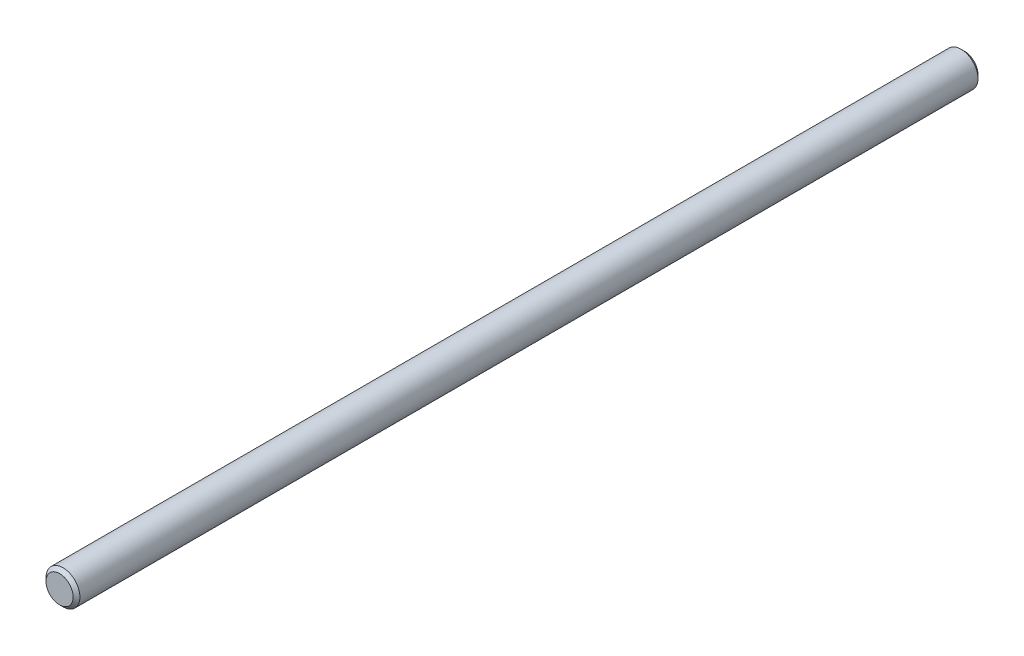
ISO-10303-21;
HEADER;
FILE_DESCRIPTION(('STEP AP214'),'2;1');
FILE_NAME('part.step','',(''),(''),'','','');
FILE_SCHEMA(('AUTOMOTIVE_DESIGN { 1 0 10303 214 1 1 1 1 }'));
ENDSEC;
DATA;
#1=APPLICATION_CONTEXT('core data for automotive mechanical design processes');
#2=APPLICATION_PROTOCOL_DEFINITION('international standard','automotive_design',2000,#1);
#3=PRODUCT_CONTEXT('',#1,'mechanical');
#4=PRODUCT('Part','Part','',(#3));
#5=PRODUCT_RELATED_PRODUCT_CATEGORY('part','',(#4));
#6=PRODUCT_DEFINITION_FORMATION('','',#4);
#7=PRODUCT_DEFINITION_CONTEXT('part definition',#1,'design');
#8=PRODUCT_DEFINITION('design','',#6,#7);
#9=PRODUCT_DEFINITION_SHAPE('','',#8);
#10=(LENGTH_UNIT() NAMED_UNIT(*) SI_UNIT(.MILLI.,.METRE.));
#11=(NAMED_UNIT(*) PLANE_ANGLE_UNIT() SI_UNIT($,.RADIAN.));
#12=(NAMED_UNIT(*) SI_UNIT($,.STERADIAN.) SOLID_ANGLE_UNIT());
#13=UNCERTAINTY_MEASURE_WITH_UNIT(LENGTH_MEASURE(1.E-05),#10,'distance_accuracy_value','');
#14=(GEOMETRIC_REPRESENTATION_CONTEXT(3) GLOBAL_UNCERTAINTY_ASSIGNED_CONTEXT((#13)) GLOBAL_UNIT_ASSIGNED_CONTEXT((#10,
#11,#12)) REPRESENTATION_CONTEXT('',''));
#15=CARTESIAN_POINT('',(0.,0.,0.));
#16=DIRECTION('',(0.,0.,1.));
#17=DIRECTION('',(1.,0.,0.));
#18=AXIS2_PLACEMENT_3D('',#15,#16,#17);
#19=CARTESIAN_POINT('',(0.,0.,127.));
#20=DIRECTION('',(0.,0.,-1.));
#21=DIRECTION('',(-1.,0.,0.));
#22=AXIS2_PLACEMENT_3D('',#19,#20,#21);
#23=CYLINDRICAL_SURFACE('',#22,4.7625);
#24=CARTESIAN_POINT('',(0.,0.,-126.0475));
#25=DIRECTION('',(0.,0.,1.));
#26=DIRECTION('',(1.,0.,0.));
#27=AXIS2_PLACEMENT_3D('',#24,#25,#26);
#28=CIRCLE('',#27,4.7625);
#29=CARTESIAN_POINT('',(-4.7625,0.,-126.0475));
#30=VERTEX_POINT('',#29);
#31=EDGE_CURVE('E48',#30,#30,#28,.T.);
#32=CARTESIAN_POINT('',(0.,0.,126.0475));
#33=DIRECTION('',(0.,0.,1.));
#34=DIRECTION('',(1.,0.,0.));
#35=AXIS2_PLACEMENT_3D('',#32,#33,#34);
#36=CIRCLE('',#35,4.7625);
#37=CARTESIAN_POINT('',(-4.7625,0.,126.0475));
#38=VERTEX_POINT('',#37);
#39=EDGE_CURVE('E52',#38,#38,#36,.F.);
#40=CARTESIAN_POINT('',(-4.7625,0.,-126.0475));
#41=CARTESIAN_POINT('',(-4.7625,0.,-123.421510416667));
#42=CARTESIAN_POINT('',(-4.7625,0.,-120.795520833333));
#43=CARTESIAN_POINT('',(-4.7625,0.,-115.543541666667));
#44=CARTESIAN_POINT('',(-4.7625,0.,-112.917552083333));
#45=CARTESIAN_POINT('',(-4.7625,0.,-107.665572916667));
#46=CARTESIAN_POINT('',(-4.7625,0.,-105.039583333333));
#47=CARTESIAN_POINT('',(-4.7625,0.,-99.7876041666666));
#48=CARTESIAN_POINT('',(-4.7625,0.,-97.1616145833333));
#49=CARTESIAN_POINT('',(-4.7625,0.,-91.9096354166666));
#50=CARTESIAN_POINT('',(-4.7625,0.,-89.2836458333333));
#51=CARTESIAN_POINT('',(-4.7625,0.,-84.0316666666667));
#52=CARTESIAN_POINT('',(-4.7625,0.,-81.4056770833333));
#53=CARTESIAN_POINT('',(-4.7625,0.,-76.1536979166666));
#54=CARTESIAN_POINT('',(-4.7625,0.,-73.5277083333333));
#55=CARTESIAN_POINT('',(-4.7625,0.,-68.2757291666667));
#56=CARTESIAN_POINT('',(-4.7625,0.,-65.6497395833333));
#57=CARTESIAN_POINT('',(-4.7625,0.,-60.3977604166667));
#58=CARTESIAN_POINT('',(-4.7625,0.,-57.7717708333333));
#59=CARTESIAN_POINT('',(-4.7625,0.,-52.5197916666667));
#60=CARTESIAN_POINT('',(-4.7625,0.,-49.8938020833333));
#61=CARTESIAN_POINT('',(-4.7625,0.,-44.6418229166667));
#62=CARTESIAN_POINT('',(-4.7625,0.,-42.0158333333333));
#63=CARTESIAN_POINT('',(-4.7625,0.,-36.7638541666667));
#64=CARTESIAN_POINT('',(-4.7625,0.,-34.1378645833333));
#65=CARTESIAN_POINT('',(-4.7625,0.,-28.8858854166667));
#66=CARTESIAN_POINT('',(-4.7625,0.,-26.2598958333333));
#67=CARTESIAN_POINT('',(-4.7625,0.,-21.0079166666667));
#68=CARTESIAN_POINT('',(-4.7625,0.,-18.3819270833333));
#69=CARTESIAN_POINT('',(-4.7625,0.,-13.1299479166667));
#70=CARTESIAN_POINT('',(-4.7625,0.,-10.5039583333333));
#71=CARTESIAN_POINT('',(-4.7625,0.,-5.25197916666666));
#72=CARTESIAN_POINT('',(-4.7625,0.,-2.62598958333333));
#73=CARTESIAN_POINT('',(-4.7625,0.,2.62598958333333));
#74=CARTESIAN_POINT('',(-4.7625,0.,5.25197916666666));
#75=CARTESIAN_POINT('',(-4.7625,0.,10.5039583333333));
#76=CARTESIAN_POINT('',(-4.7625,0.,13.1299479166667));
#77=CARTESIAN_POINT('',(-4.7625,0.,18.3819270833333));
#78=CARTESIAN_POINT('',(-4.7625,0.,21.0079166666667));
#79=CARTESIAN_POINT('',(-4.7625,0.,26.2598958333333));
#80=CARTESIAN_POINT('',(-4.7625,0.,28.8858854166667));
#81=CARTESIAN_POINT('',(-4.7625,0.,34.1378645833333));
#82=CARTESIAN_POINT('',(-4.7625,0.,36.7638541666667));
#83=CARTESIAN_POINT('',(-4.7625,0.,42.0158333333333));
#84=CARTESIAN_POINT('',(-4.7625,0.,44.6418229166667));
#85=CARTESIAN_POINT('',(-4.7625,0.,49.8938020833333));
#86=CARTESIAN_POINT('',(-4.7625,0.,52.5197916666667));
#87=CARTESIAN_POINT('',(-4.7625,0.,57.7717708333333));
#88=CARTESIAN_POINT('',(-4.7625,0.,60.3977604166667));
#89=CARTESIAN_POINT('',(-4.7625,0.,65.6497395833333));
#90=CARTESIAN_POINT('',(-4.7625,0.,68.2757291666667));
#91=CARTESIAN_POINT('',(-4.7625,0.,73.5277083333333));
#92=CARTESIAN_POINT('',(-4.7625,0.,76.1536979166666));
#93=CARTESIAN_POINT('',(-4.7625,0.,81.4056770833333));
#94=CARTESIAN_POINT('',(-4.7625,0.,84.0316666666667));
#95=CARTESIAN_POINT('',(-4.7625,0.,89.2836458333333));
#96=CARTESIAN_POINT('',(-4.7625,0.,91.9096354166666));
#97=CARTESIAN_POINT('',(-4.7625,0.,97.1616145833333));
#98=CARTESIAN_POINT('',(-4.7625,0.,99.7876041666666));
#99=CARTESIAN_POINT('',(-4.7625,0.,105.039583333333));
#100=CARTESIAN_POINT('',(-4.7625,0.,107.665572916667));
#101=CARTESIAN_POINT('',(-4.7625,0.,112.917552083333));
#102=CARTESIAN_POINT('',(-4.7625,0.,115.543541666667));
#103=CARTESIAN_POINT('',(-4.7625,0.,120.795520833333));
#104=CARTESIAN_POINT('',(-4.7625,0.,123.421510416667));
#105=CARTESIAN_POINT('',(-4.7625,0.,126.0475));
#106=B_SPLINE_CURVE_WITH_KNOTS('',3,(#40,#41,#42,#43,#44,#45,#46,#47,#48,#49,#50,#51,#52,#53,
#54,#55,#56,#57,#58,#59,#60,#61,#62,#63,#64,#65,#66,#67,#68,#69,#70,#71,#72,#73,#74,#75,#76,#77,
#78,#79,#80,#81,#82,#83,#84,#85,#86,#87,#88,#89,#90,#91,#92,#93,#94,#95,#96,#97,#98,#99,#100,
#101,#102,#103,#104,#105),.UNSPECIFIED.,.F.,.F.,(4,2,2,2,2,2,2,2,2,2,2,2,2,2,2,2,2,2,2,2,2,2,2,
2,2,2,2,2,2,2,2,2,4),(0.,7.87796874999999,15.7559375,23.63390625,31.511875,39.38984375,
47.2678125,55.14578125,63.02375,70.90171875,78.7796875,86.65765625,94.535625,102.41359375,
110.2915625,118.16953125,126.0475,133.92546875,141.8034375,149.68140625,157.559375,165.43734375,
173.3153125,181.19328125,189.07125,196.94921875,204.8271875,212.70515625,220.583125,
228.46109375,236.3390625,244.21703125,252.095),.UNSPECIFIED.);
#107=EDGE_CURVE('BSEAM37',#30,#38,#106,.T.);
#108=ORIENTED_EDGE('',*,*,#31,.T.);
#109=ORIENTED_EDGE('',*,*,#39,.T.);
#110=ORIENTED_EDGE('',*,*,#107,.T.);
#111=ORIENTED_EDGE('',*,*,#107,.F.);
#112=EDGE_LOOP('',(#108,#110,#109,#111));
#113=FACE_BOUND('',#112,.T.);
#114=ADVANCED_FACE('F37',(#113),#23,.T.);
#115=CARTESIAN_POINT('',(0.,0.,127.));
#116=DIRECTION('',(0.,0.,1.));
#117=DIRECTION('',(1.,0.,0.));
#118=AXIS2_PLACEMENT_3D('',#115,#116,#117);
#119=PLANE('',#118);
#120=CARTESIAN_POINT('',(0.,0.,127.));
#121=DIRECTION('',(0.,0.,1.));
#122=DIRECTION('',(1.,0.,0.));
#123=AXIS2_PLACEMENT_3D('',#120,#121,#122);
#124=CIRCLE('',#123,3.80999999999998);
#125=CARTESIAN_POINT('',(-3.80999999999999,0.,127.));
#126=VERTEX_POINT('',#125);
#127=EDGE_CURVE('E10',#126,#126,#124,.T.);
#128=ORIENTED_EDGE('',*,*,#127,.T.);
#129=EDGE_LOOP('',(#128));
#130=FACE_BOUND('',#129,.T.);
#131=ADVANCED_FACE('F68',(#130),#119,.T.);
#132=CARTESIAN_POINT('',(0.,0.,-127.));
#133=DIRECTION('',(0.,0.,1.));
#134=DIRECTION('',(1.,0.,0.));
#135=AXIS2_PLACEMENT_3D('',#132,#133,#134);
#136=PLANE('',#135);
#137=CARTESIAN_POINT('',(0.,0.,-127.));
#138=DIRECTION('',(0.,0.,1.));
#139=DIRECTION('',(1.,0.,0.));
#140=AXIS2_PLACEMENT_3D('',#137,#138,#139);
#141=CIRCLE('',#140,3.80999999999995);
#142=CARTESIAN_POINT('',(3.80999999999995,0.,-127.));
#143=VERTEX_POINT('',#142);
#144=EDGE_CURVE('E44',#143,#143,#141,.F.);
#145=ORIENTED_EDGE('',*,*,#144,.T.);
#146=EDGE_LOOP('',(#145));
#147=FACE_BOUND('',#146,.T.);
#148=ADVANCED_FACE('F65',(#147),#136,.F.);
#149=CARTESIAN_POINT('',(0.,0.,-126.0475));
#150=DIRECTION('',(0.,0.,1.));
#151=DIRECTION('',(1.,0.,0.));
#152=AXIS2_PLACEMENT_3D('',#149,#150,#151);
#153=CONICAL_SURFACE('',#152,4.7625,0.785398163397461);
#154=ORIENTED_EDGE('',*,*,#144,.F.);
#155=EDGE_LOOP('',(#154));
#156=FACE_BOUND('',#155,.T.);
#157=ORIENTED_EDGE('',*,*,#31,.F.);
#158=EDGE_LOOP('',(#157));
#159=FACE_BOUND('',#158,.T.);
#160=ADVANCED_FACE('F61',(#156,#159),#153,.T.);
#161=CARTESIAN_POINT('',(0.,0.,127.));
#162=DIRECTION('',(0.,0.,-1.));
#163=DIRECTION('',(-1.,0.,0.));
#164=AXIS2_PLACEMENT_3D('',#161,#162,#163);
#165=CONICAL_SURFACE('',#164,3.80999999999998,0.785398163397447);
#166=CARTESIAN_POINT('',(-4.76250000000001,0.,126.0475));
#167=CARTESIAN_POINT('',(-4.75257812500001,0.,126.057421875));
#168=CARTESIAN_POINT('',(-4.74265625000001,0.,126.06734375));
#169=CARTESIAN_POINT('',(-4.72281250000001,0.,126.0871875));
#170=CARTESIAN_POINT('',(-4.71289062500002,0.,126.097109375));
#171=CARTESIAN_POINT('',(-4.69304687500001,0.,126.116953125));
#172=CARTESIAN_POINT('',(-4.68312500000001,0.,126.126875));
#173=CARTESIAN_POINT('',(-4.66328125000001,0.,126.14671875));
#174=CARTESIAN_POINT('',(-4.65335937500001,0.,126.156640625));
#175=CARTESIAN_POINT('',(-4.63351562500001,0.,126.176484375));
#176=CARTESIAN_POINT('',(-4.62359375000001,0.,126.18640625));
#177=CARTESIAN_POINT('',(-4.60375000000001,0.,126.20625));
#178=CARTESIAN_POINT('',(-4.59382812500001,0.,126.216171875));
#179=CARTESIAN_POINT('',(-4.57398437500001,0.,126.236015625));
#180=CARTESIAN_POINT('',(-4.56406250000001,0.,126.2459375));
#181=CARTESIAN_POINT('',(-4.54421875000001,0.,126.26578125));
#182=CARTESIAN_POINT('',(-4.53429687500001,0.,126.275703125));
#183=CARTESIAN_POINT('',(-4.514453125,0.,126.295546875));
#184=CARTESIAN_POINT('',(-4.50453125000001,0.,126.30546875));
#185=CARTESIAN_POINT('',(-4.48468750000001,0.,126.3253125));
#186=CARTESIAN_POINT('',(-4.47476562500001,0.,126.335234375));
#187=CARTESIAN_POINT('',(-4.45492187500001,0.,126.355078125));
#188=CARTESIAN_POINT('',(-4.44500000000001,0.,126.365));
#189=CARTESIAN_POINT('',(-4.42515625,0.,126.38484375));
#190=CARTESIAN_POINT('',(-4.415234375,0.,126.394765625));
#191=CARTESIAN_POINT('',(-4.39539062500001,0.,126.414609375));
#192=CARTESIAN_POINT('',(-4.38546875000001,0.,126.42453125));
#193=CARTESIAN_POINT('',(-4.36562500000001,0.,126.444375));
#194=CARTESIAN_POINT('',(-4.355703125,0.,126.454296875));
#195=CARTESIAN_POINT('',(-4.335859375,0.,126.474140625));
#196=CARTESIAN_POINT('',(-4.32593750000001,0.,126.4840625));
#197=CARTESIAN_POINT('',(-4.30609375000001,0.,126.50390625));
#198=CARTESIAN_POINT('',(-4.296171875,0.,126.513828125));
#199=CARTESIAN_POINT('',(-4.276328125,0.,126.533671875));
#200=CARTESIAN_POINT('',(-4.26640625,0.,126.54359375));
#201=CARTESIAN_POINT('',(-4.2465625,0.,126.5634375));
#202=CARTESIAN_POINT('',(-4.23664062500001,0.,126.573359375));
#203=CARTESIAN_POINT('',(-4.216796875,0.,126.593203125));
#204=CARTESIAN_POINT('',(-4.206875,0.,126.603125));
#205=CARTESIAN_POINT('',(-4.18703125,0.,126.62296875));
#206=CARTESIAN_POINT('',(-4.177109375,0.,126.632890625));
#207=CARTESIAN_POINT('',(-4.157265625,0.,126.652734375));
#208=CARTESIAN_POINT('',(-4.14734375,0.,126.66265625));
#209=CARTESIAN_POINT('',(-4.1275,0.,126.6825));
#210=CARTESIAN_POINT('',(-4.117578125,0.,126.692421875));
#211=CARTESIAN_POINT('',(-4.097734375,0.,126.712265625));
#212=CARTESIAN_POINT('',(-4.0878125,0.,126.7221875));
#213=CARTESIAN_POINT('',(-4.06796875,0.,126.74203125));
#214=CARTESIAN_POINT('',(-4.058046875,0.,126.751953125));
#215=CARTESIAN_POINT('',(-4.038203125,0.,126.771796875));
#216=CARTESIAN_POINT('',(-4.02828125,0.,126.78171875));
#217=CARTESIAN_POINT('',(-4.0084375,0.,126.8015625));
#218=CARTESIAN_POINT('',(-3.998515625,0.,126.811484375));
#219=CARTESIAN_POINT('',(-3.978671875,0.,126.831328125));
#220=CARTESIAN_POINT('',(-3.96875,0.,126.84125));
#221=CARTESIAN_POINT('',(-3.94890624999999,0.,126.86109375));
#222=CARTESIAN_POINT('',(-3.938984375,0.,126.871015625));
#223=CARTESIAN_POINT('',(-3.919140625,0.,126.890859375));
#224=CARTESIAN_POINT('',(-3.90921875,0.,126.90078125));
#225=CARTESIAN_POINT('',(-3.889375,0.,126.920625));
#226=CARTESIAN_POINT('',(-3.87945312499999,0.,126.930546875));
#227=CARTESIAN_POINT('',(-3.85960937499999,0.,126.950390625));
#228=CARTESIAN_POINT('',(-3.84968749999999,0.,126.9603125));
#229=CARTESIAN_POINT('',(-3.82984375,0.,126.98015625));
#230=CARTESIAN_POINT('',(-3.819921875,0.,126.990078125));
#231=CARTESIAN_POINT('',(-3.80999999999999,0.,127.));
#232=B_SPLINE_CURVE_WITH_KNOTS('',3,(#166,#167,#168,#169,#170,#171,#172,#173,#174,#175,#176,
#177,#178,#179,#180,#181,#182,#183,#184,#185,#186,#187,#188,#189,#190,#191,#192,#193,#194,#195,
#196,#197,#198,#199,#200,#201,#202,#203,#204,#205,#206,#207,#208,#209,#210,#211,#212,#213,#214,
#215,#216,#217,#218,#219,#220,#221,#222,#223,#224,#225,#226,#227,#228,#229,#230,#231),
.UNSPECIFIED.,.F.,.F.,(4,2,2,2,2,2,2,2,2,2,2,2,2,2,2,2,2,2,2,2,2,2,2,2,2,2,2,2,2,2,2,2,4),(0.,
0.04209495056752,0.08418990113504,0.12628485170254,0.16837980227006,0.21047475283758,
0.25256970340508,0.2946646539726,0.336759604540101,0.378854555107621,0.42094950567514,
0.46304445624264,0.50513940681016,0.54723435737768,0.589329307945181,0.631424258512701,
0.673519209080201,0.715614159647721,0.757709110215241,0.799804060782742,0.841899011350261,
0.883993961917781,0.926088912485281,0.968183863052801,1.01027881362032,1.05237376418782,
1.09446871475534,1.13656366532284,1.17865861589036,1.22075356645788,1.26284851702538,
1.3049434675929,1.34703841816042),.UNSPECIFIED.);
#233=EDGE_CURVE('BSEAM39',#38,#126,#232,.T.);
#234=ORIENTED_EDGE('',*,*,#39,.F.);
#235=ORIENTED_EDGE('',*,*,#127,.F.);
#236=ORIENTED_EDGE('',*,*,#233,.T.);
#237=ORIENTED_EDGE('',*,*,#233,.F.);
#238=EDGE_LOOP('',(#234,#236,#235,#237));
#239=FACE_BOUND('',#238,.T.);
#240=ADVANCED_FACE('F39',(#239),#165,.T.);
#241=CLOSED_SHELL('',(#114,#131,#148,#160,#240));
#242=MANIFOLD_SOLID_BREP('B2',#241);
#243=ADVANCED_BREP_SHAPE_REPRESENTATION('',(#18,#242),#14);
#244=SHAPE_DEFINITION_REPRESENTATION(#9,#243);
ENDSEC;
END-ISO-10303-21;
